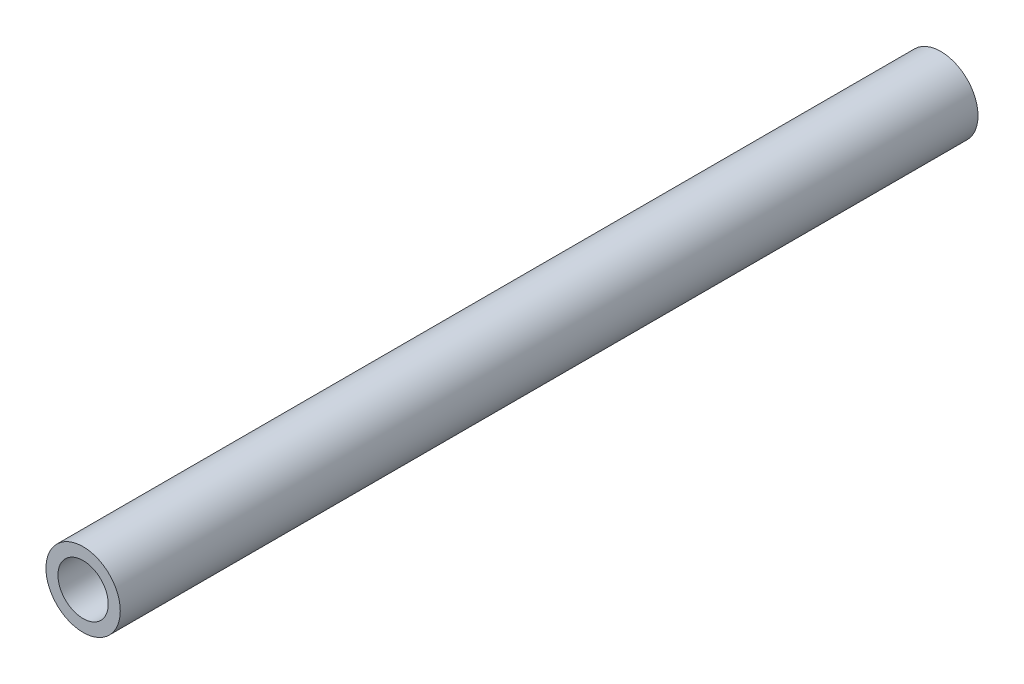
ISO-10303-21;
HEADER;
FILE_DESCRIPTION(('STEP AP214'),'2;1');
FILE_NAME('part.step','',(''),(''),'','','');
FILE_SCHEMA(('AUTOMOTIVE_DESIGN { 1 0 10303 214 1 1 1 1 }'));
ENDSEC;
DATA;
#1=APPLICATION_CONTEXT('core data for automotive mechanical design processes');
#2=APPLICATION_PROTOCOL_DEFINITION('international standard','automotive_design',2000,#1);
#3=PRODUCT_CONTEXT('',#1,'mechanical');
#4=PRODUCT('Part','Part','',(#3));
#5=PRODUCT_RELATED_PRODUCT_CATEGORY('part','',(#4));
#6=PRODUCT_DEFINITION_FORMATION('','',#4);
#7=PRODUCT_DEFINITION_CONTEXT('part definition',#1,'design');
#8=PRODUCT_DEFINITION('design','',#6,#7);
#9=PRODUCT_DEFINITION_SHAPE('','',#8);
#10=(LENGTH_UNIT() NAMED_UNIT(*) SI_UNIT(.MILLI.,.METRE.));
#11=(NAMED_UNIT(*) PLANE_ANGLE_UNIT() SI_UNIT($,.RADIAN.));
#12=(NAMED_UNIT(*) SI_UNIT($,.STERADIAN.) SOLID_ANGLE_UNIT());
#13=UNCERTAINTY_MEASURE_WITH_UNIT(LENGTH_MEASURE(1.E-05),#10,'distance_accuracy_value','');
#14=(GEOMETRIC_REPRESENTATION_CONTEXT(3) GLOBAL_UNCERTAINTY_ASSIGNED_CONTEXT((#13)) GLOBAL_UNIT_ASSIGNED_CONTEXT((#10,
#11,#12)) REPRESENTATION_CONTEXT('',''));
#15=CARTESIAN_POINT('',(0.,0.,0.));
#16=DIRECTION('',(0.,0.,1.));
#17=DIRECTION('',(1.,0.,0.));
#18=AXIS2_PLACEMENT_3D('',#15,#16,#17);
#19=CARTESIAN_POINT('',(0.,0.,150.));
#20=DIRECTION('',(0.,0.,1.));
#21=DIRECTION('',(1.,0.,0.));
#22=AXIS2_PLACEMENT_3D('',#19,#20,#21);
#23=PLANE('',#22);
#24=CARTESIAN_POINT('',(0.,0.,150.));
#25=DIRECTION('',(0.,0.,1.));
#26=DIRECTION('',(1.,0.,0.));
#27=AXIS2_PLACEMENT_3D('',#24,#25,#26);
#28=CIRCLE('',#27,6.5);
#29=CARTESIAN_POINT('',(6.5,0.,150.));
#30=VERTEX_POINT('',#29);
#31=EDGE_CURVE('E10',#30,#30,#28,.T.);
#32=ORIENTED_EDGE('',*,*,#31,.T.);
#33=EDGE_LOOP('',(#32));
#34=FACE_BOUND('',#33,.T.);
#35=CARTESIAN_POINT('',(0.,0.,150.));
#36=DIRECTION('',(0.,0.,1.));
#37=DIRECTION('',(1.,0.,0.));
#38=AXIS2_PLACEMENT_3D('',#35,#36,#37);
#39=CIRCLE('',#38,4.4);
#40=CARTESIAN_POINT('',(4.4,0.,150.));
#41=VERTEX_POINT('',#40);
#42=EDGE_CURVE('E56',#41,#41,#39,.T.);
#43=ORIENTED_EDGE('',*,*,#42,.F.);
#44=EDGE_LOOP('',(#43));
#45=FACE_BOUND('',#44,.T.);
#46=ADVANCED_FACE('F43',(#34,#45),#23,.T.);
#47=CARTESIAN_POINT('',(0.,0.,0.));
#48=DIRECTION('',(0.,0.,1.));
#49=DIRECTION('',(1.,0.,0.));
#50=AXIS2_PLACEMENT_3D('',#47,#48,#49);
#51=PLANE('',#50);
#52=CARTESIAN_POINT('',(0.,0.,0.));
#53=DIRECTION('',(0.,0.,1.));
#54=DIRECTION('',(1.,0.,0.));
#55=AXIS2_PLACEMENT_3D('',#52,#53,#54);
#56=CIRCLE('',#55,6.5);
#57=CARTESIAN_POINT('',(6.5,0.,0.));
#58=VERTEX_POINT('',#57);
#59=EDGE_CURVE('E47',#58,#58,#56,.T.);
#60=ORIENTED_EDGE('',*,*,#59,.F.);
#61=EDGE_LOOP('',(#60));
#62=FACE_BOUND('',#61,.T.);
#63=CARTESIAN_POINT('',(0.,0.,0.));
#64=DIRECTION('',(0.,0.,1.));
#65=DIRECTION('',(1.,0.,0.));
#66=AXIS2_PLACEMENT_3D('',#63,#64,#65);
#67=CIRCLE('',#66,4.4);
#68=CARTESIAN_POINT('',(4.4,0.,0.));
#69=VERTEX_POINT('',#68);
#70=EDGE_CURVE('E58',#69,#69,#67,.T.);
#71=ORIENTED_EDGE('',*,*,#70,.T.);
#72=EDGE_LOOP('',(#71));
#73=FACE_BOUND('',#72,.T.);
#74=ADVANCED_FACE('F70',(#62,#73),#51,.F.);
#75=CARTESIAN_POINT('',(0.,0.,150.));
#76=DIRECTION('',(0.,0.,-1.));
#77=DIRECTION('',(-1.,0.,0.));
#78=AXIS2_PLACEMENT_3D('',#75,#76,#77);
#79=CYLINDRICAL_SURFACE('',#78,6.5);
#80=ORIENTED_EDGE('',*,*,#31,.F.);
#81=EDGE_LOOP('',(#80));
#82=FACE_BOUND('',#81,.T.);
#83=ORIENTED_EDGE('',*,*,#59,.T.);
#84=EDGE_LOOP('',(#83));
#85=FACE_BOUND('',#84,.T.);
#86=ADVANCED_FACE('F45',(#82,#85),#79,.T.);
#87=CARTESIAN_POINT('',(0.,0.,150.));
#88=DIRECTION('',(0.,0.,-1.));
#89=DIRECTION('',(-1.,0.,0.));
#90=AXIS2_PLACEMENT_3D('',#87,#88,#89);
#91=CYLINDRICAL_SURFACE('',#90,4.4);
#92=ORIENTED_EDGE('',*,*,#42,.T.);
#93=EDGE_LOOP('',(#92));
#94=FACE_BOUND('',#93,.T.);
#95=ORIENTED_EDGE('',*,*,#70,.F.);
#96=EDGE_LOOP('',(#95));
#97=FACE_BOUND('',#96,.T.);
#98=ADVANCED_FACE('F66',(#94,#97),#91,.F.);
#99=CLOSED_SHELL('',(#46,#74,#86,#98));
#100=MANIFOLD_SOLID_BREP('B2',#99);
#101=ADVANCED_BREP_SHAPE_REPRESENTATION('',(#18,#100),#14);
#102=SHAPE_DEFINITION_REPRESENTATION(#9,#101);
ENDSEC;
END-ISO-10303-21;
